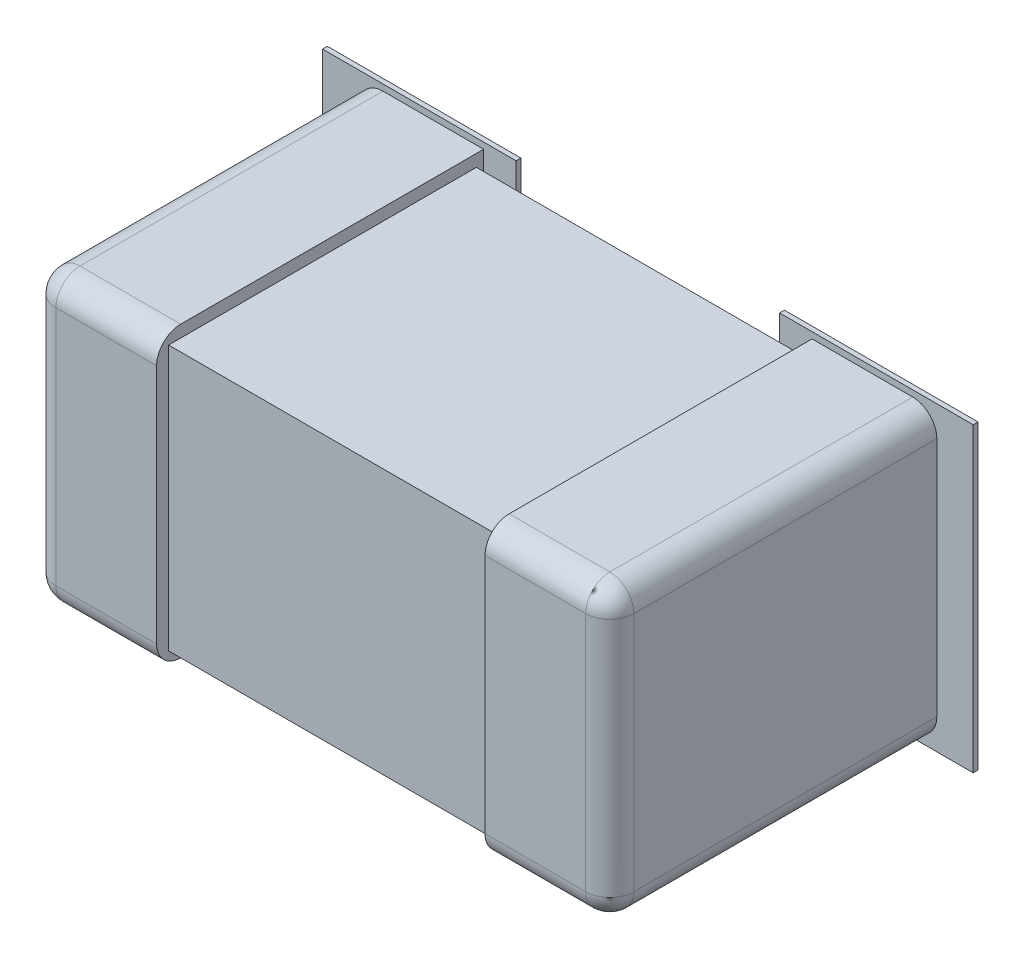
ISO-10303-21;
HEADER;
FILE_DESCRIPTION(('STEP AP214'),'2;1');
FILE_NAME('part.step','',(''),(''),'','','');
FILE_SCHEMA(('AUTOMOTIVE_DESIGN { 1 0 10303 214 1 1 1 1 }'));
ENDSEC;
DATA;
#1=APPLICATION_CONTEXT('core data for automotive mechanical design processes');
#2=APPLICATION_PROTOCOL_DEFINITION('international standard','automotive_design',2000,#1);
#3=PRODUCT_CONTEXT('',#1,'mechanical');
#4=PRODUCT('Part','Part','',(#3));
#5=PRODUCT_RELATED_PRODUCT_CATEGORY('part','',(#4));
#6=PRODUCT_DEFINITION_FORMATION('','',#4);
#7=PRODUCT_DEFINITION_CONTEXT('part definition',#1,'design');
#8=PRODUCT_DEFINITION('design','',#6,#7);
#9=PRODUCT_DEFINITION_SHAPE('','',#8);
#10=(LENGTH_UNIT() NAMED_UNIT(*) SI_UNIT(.MILLI.,.METRE.));
#11=(NAMED_UNIT(*) PLANE_ANGLE_UNIT() SI_UNIT($,.RADIAN.));
#12=(NAMED_UNIT(*) SI_UNIT($,.STERADIAN.) SOLID_ANGLE_UNIT());
#13=UNCERTAINTY_MEASURE_WITH_UNIT(LENGTH_MEASURE(1.E-05),#10,'distance_accuracy_value','');
#14=(GEOMETRIC_REPRESENTATION_CONTEXT(3) GLOBAL_UNCERTAINTY_ASSIGNED_CONTEXT((#13)) GLOBAL_UNIT_ASSIGNED_CONTEXT((#10,
#11,#12)) REPRESENTATION_CONTEXT('',''));
#15=CARTESIAN_POINT('',(0.,0.,0.));
#16=DIRECTION('',(0.,0.,1.));
#17=DIRECTION('',(1.,0.,0.));
#18=AXIS2_PLACEMENT_3D('',#15,#16,#17);
#19=CARTESIAN_POINT('',(0.,0.,0.0762));
#20=DIRECTION('',(0.,0.,1.));
#21=DIRECTION('',(1.,0.,0.));
#22=AXIS2_PLACEMENT_3D('',#19,#20,#21);
#23=PLANE('',#22);
#24=DIRECTION('',(1.,0.,0.));
#25=VECTOR('',#24,1.);
#26=CARTESIAN_POINT('',(0.138938,-0.159004,0.0762));
#27=LINE('',#26,#25);
#28=CARTESIAN_POINT('',(0.138938,-0.159004,0.0762));
#29=VERTEX_POINT('',#28);
#30=CARTESIAN_POINT('',(0.343154,-0.159004,0.0762));
#31=VERTEX_POINT('',#30);
#32=EDGE_CURVE('E341',#29,#31,#27,.T.);
#33=ORIENTED_EDGE('',*,*,#32,.F.);
#34=DIRECTION('',(0.,1.,0.));
#35=VECTOR('',#34,1.);
#36=CARTESIAN_POINT('',(0.138938,0.159004,0.0762));
#37=LINE('',#36,#35);
#38=CARTESIAN_POINT('',(0.138938,0.159004,0.0762));
#39=VERTEX_POINT('',#38);
#40=EDGE_CURVE('E347',#39,#29,#37,.F.);
#41=ORIENTED_EDGE('',*,*,#40,.F.);
#42=DIRECTION('',(1.,0.,0.));
#43=VECTOR('',#42,1.);
#44=CARTESIAN_POINT('',(0.343154,0.159004,0.0762));
#45=LINE('',#44,#43);
#46=CARTESIAN_POINT('',(0.343154,0.159004,0.0762));
#47=VERTEX_POINT('',#46);
#48=EDGE_CURVE('E326',#47,#39,#45,.F.);
#49=ORIENTED_EDGE('',*,*,#48,.F.);
#50=DIRECTION('',(0.,1.,0.));
#51=VECTOR('',#50,1.);
#52=CARTESIAN_POINT('',(0.343154,-0.159004,0.0762));
#53=LINE('',#52,#51);
#54=EDGE_CURVE('E335',#31,#47,#53,.T.);
#55=ORIENTED_EDGE('',*,*,#54,.F.);
#56=EDGE_LOOP('',(#33,#41,#49,#55));
#57=FACE_BOUND('',#56,.T.);
#58=ADVANCED_FACE('F17',(#57),#23,.F.);
#59=CARTESIAN_POINT('',(0.2794,0.127,0.400812));
#60=DIRECTION('',(0.,0.707106781186548,0.707106781186548));
#61=DIRECTION('',(1.,0.,0.));
#62=AXIS2_PLACEMENT_3D('',#59,#60,#61);
#63=SPHERICAL_SURFACE('',#62,0.0254);
#64=CARTESIAN_POINT('',(0.2794,0.127,0.400812));
#65=DIRECTION('',(-1.,0.,0.));
#66=DIRECTION('',(0.,0.,1.));
#67=AXIS2_PLACEMENT_3D('',#64,#65,#66);
#68=CIRCLE('',#67,0.0254);
#69=CARTESIAN_POINT('',(0.2794,0.127,0.426212));
#70=VERTEX_POINT('',#69);
#71=CARTESIAN_POINT('',(0.2794,0.144960512242138,0.418772512242138));
#72=VERTEX_POINT('',#71);
#73=EDGE_CURVE('E313',#70,#72,#68,.T.);
#74=ORIENTED_EDGE('',*,*,#73,.F.);
#75=CARTESIAN_POINT('',(0.2794,0.127,0.400812));
#76=DIRECTION('',(0.,1.,0.));
#77=DIRECTION('',(0.,0.,1.));
#78=AXIS2_PLACEMENT_3D('',#75,#76,#77);
#79=CIRCLE('',#78,0.0254);
#80=CARTESIAN_POINT('',(0.3048,0.127,0.400812));
#81=VERTEX_POINT('',#80);
#82=EDGE_CURVE('E319',#81,#70,#79,.F.);
#83=ORIENTED_EDGE('',*,*,#82,.F.);
#84=CARTESIAN_POINT('',(0.2794,0.127,0.400812));
#85=DIRECTION('',(0.,0.,-1.));
#86=DIRECTION('',(-1.,0.,0.));
#87=AXIS2_PLACEMENT_3D('',#84,#85,#86);
#88=CIRCLE('',#87,0.0254);
#89=CARTESIAN_POINT('',(0.2794,0.1524,0.400812));
#90=VERTEX_POINT('',#89);
#91=EDGE_CURVE('E20',#90,#81,#88,.T.);
#92=ORIENTED_EDGE('',*,*,#91,.F.);
#93=CARTESIAN_POINT('',(0.2794,0.127,0.400812));
#94=DIRECTION('',(-1.,0.,0.));
#95=DIRECTION('',(0.,0.,1.));
#96=AXIS2_PLACEMENT_3D('',#93,#94,#95);
#97=CIRCLE('',#96,0.0254);
#98=EDGE_CURVE('E56',#72,#90,#97,.T.);
#99=ORIENTED_EDGE('',*,*,#98,.F.);
#100=EDGE_LOOP('',(#74,#83,#92,#99));
#101=FACE_BOUND('',#100,.T.);
#102=ADVANCED_FACE('F373',(#101),#63,.T.);
#103=CARTESIAN_POINT('',(0.2794,-0.127,0.400812));
#104=DIRECTION('',(0.707106781186548,0.,0.707106781186548));
#105=DIRECTION('',(0.,-1.,0.));
#106=AXIS2_PLACEMENT_3D('',#103,#104,#105);
#107=SPHERICAL_SURFACE('',#106,0.0254);
#108=CARTESIAN_POINT('',(0.2794,-0.127,0.400812));
#109=DIRECTION('',(0.,1.,0.));
#110=DIRECTION('',(0.,0.,1.));
#111=AXIS2_PLACEMENT_3D('',#108,#109,#110);
#112=CIRCLE('',#111,0.0254);
#113=CARTESIAN_POINT('',(0.2794,-0.127,0.426212));
#114=VERTEX_POINT('',#113);
#115=CARTESIAN_POINT('',(0.297360512242138,-0.127,0.418772512242138));
#116=VERTEX_POINT('',#115);
#117=EDGE_CURVE('E35',#114,#116,#112,.T.);
#118=ORIENTED_EDGE('',*,*,#117,.F.);
#119=CARTESIAN_POINT('',(0.2794,-0.127,0.400812));
#120=DIRECTION('',(1.,0.,0.));
#121=DIRECTION('',(0.,0.,-1.));
#122=AXIS2_PLACEMENT_3D('',#119,#120,#121);
#123=CIRCLE('',#122,0.0254);
#124=CARTESIAN_POINT('',(0.2794,-0.1524,0.400812));
#125=VERTEX_POINT('',#124);
#126=EDGE_CURVE('E398',#125,#114,#123,.F.);
#127=ORIENTED_EDGE('',*,*,#126,.F.);
#128=CARTESIAN_POINT('',(0.2794,-0.127,0.400812));
#129=DIRECTION('',(0.,0.,-1.));
#130=DIRECTION('',(-1.,0.,0.));
#131=AXIS2_PLACEMENT_3D('',#128,#129,#130);
#132=CIRCLE('',#131,0.0254);
#133=CARTESIAN_POINT('',(0.3048,-0.127,0.400812));
#134=VERTEX_POINT('',#133);
#135=EDGE_CURVE('E323',#134,#125,#132,.T.);
#136=ORIENTED_EDGE('',*,*,#135,.F.);
#137=CARTESIAN_POINT('',(0.2794,-0.127,0.400812));
#138=DIRECTION('',(0.,1.,0.));
#139=DIRECTION('',(0.,0.,1.));
#140=AXIS2_PLACEMENT_3D('',#137,#138,#139);
#141=CIRCLE('',#140,0.0254);
#142=EDGE_CURVE('E318',#116,#134,#141,.T.);
#143=ORIENTED_EDGE('',*,*,#142,.F.);
#144=EDGE_LOOP('',(#118,#127,#136,#143));
#145=FACE_BOUND('',#144,.T.);
#146=ADVANCED_FACE('F369',(#145),#107,.T.);
#147=CARTESIAN_POINT('',(0.,0.,0.0762));
#148=DIRECTION('',(0.,0.,1.));
#149=DIRECTION('',(1.,0.,0.));
#150=AXIS2_PLACEMENT_3D('',#147,#148,#149);
#151=PLANE('',#150);
#152=DIRECTION('',(1.,0.,0.));
#153=VECTOR('',#152,1.);
#154=CARTESIAN_POINT('',(-0.138938,0.159004,0.0762));
#155=LINE('',#154,#153);
#156=CARTESIAN_POINT('',(-0.138938,0.159004,0.0762));
#157=VERTEX_POINT('',#156);
#158=CARTESIAN_POINT('',(-0.343154,0.159004,0.0762));
#159=VERTEX_POINT('',#158);
#160=EDGE_CURVE('E302',#157,#159,#155,.F.);
#161=ORIENTED_EDGE('',*,*,#160,.F.);
#162=DIRECTION('',(0.,1.,0.));
#163=VECTOR('',#162,1.);
#164=CARTESIAN_POINT('',(-0.138938,-0.159004,0.0762));
#165=LINE('',#164,#163);
#166=CARTESIAN_POINT('',(-0.138938,-0.159004,0.0762));
#167=VERTEX_POINT('',#166);
#168=EDGE_CURVE('E308',#167,#157,#165,.T.);
#169=ORIENTED_EDGE('',*,*,#168,.F.);
#170=DIRECTION('',(1.,0.,0.));
#171=VECTOR('',#170,1.);
#172=CARTESIAN_POINT('',(-0.343154,-0.159004,0.0762));
#173=LINE('',#172,#171);
#174=CARTESIAN_POINT('',(-0.343154,-0.159004,0.0762));
#175=VERTEX_POINT('',#174);
#176=EDGE_CURVE('E287',#175,#167,#173,.T.);
#177=ORIENTED_EDGE('',*,*,#176,.F.);
#178=DIRECTION('',(0.,1.,0.));
#179=VECTOR('',#178,1.);
#180=CARTESIAN_POINT('',(-0.343154,0.159004,0.0762));
#181=LINE('',#180,#179);
#182=EDGE_CURVE('E296',#159,#175,#181,.F.);
#183=ORIENTED_EDGE('',*,*,#182,.F.);
#184=EDGE_LOOP('',(#161,#169,#177,#183));
#185=FACE_BOUND('',#184,.T.);
#186=ADVANCED_FACE('F365',(#185),#151,.F.);
#187=CARTESIAN_POINT('',(-0.2794,-0.127,0.400812));
#188=DIRECTION('',(0.,-0.707106781186548,0.707106781186548));
#189=DIRECTION('',(-1.,0.,0.));
#190=AXIS2_PLACEMENT_3D('',#187,#188,#189);
#191=SPHERICAL_SURFACE('',#190,0.0254);
#192=CARTESIAN_POINT('',(-0.2794,-0.127,0.400812));
#193=DIRECTION('',(1.,0.,0.));
#194=DIRECTION('',(0.,0.,-1.));
#195=AXIS2_PLACEMENT_3D('',#192,#193,#194);
#196=CIRCLE('',#195,0.0254);
#197=CARTESIAN_POINT('',(-0.2794,-0.127,0.426212));
#198=VERTEX_POINT('',#197);
#199=CARTESIAN_POINT('',(-0.2794,-0.144960512242138,0.418772512242138));
#200=VERTEX_POINT('',#199);
#201=EDGE_CURVE('E271',#198,#200,#196,.T.);
#202=ORIENTED_EDGE('',*,*,#201,.F.);
#203=CARTESIAN_POINT('',(-0.2794,-0.127,0.400812));
#204=DIRECTION('',(0.,-1.,0.));
#205=DIRECTION('',(0.,0.,-1.));
#206=AXIS2_PLACEMENT_3D('',#203,#204,#205);
#207=CIRCLE('',#206,0.0254);
#208=CARTESIAN_POINT('',(-0.3048,-0.127,0.400812));
#209=VERTEX_POINT('',#208);
#210=EDGE_CURVE('E285',#209,#198,#207,.F.);
#211=ORIENTED_EDGE('',*,*,#210,.F.);
#212=CARTESIAN_POINT('',(-0.2794,-0.127,0.400812));
#213=DIRECTION('',(0.,0.,-1.));
#214=DIRECTION('',(-1.,0.,0.));
#215=AXIS2_PLACEMENT_3D('',#212,#213,#214);
#216=CIRCLE('',#215,0.0254);
#217=CARTESIAN_POINT('',(-0.2794,-0.1524,0.400812));
#218=VERTEX_POINT('',#217);
#219=EDGE_CURVE('E286',#218,#209,#216,.T.);
#220=ORIENTED_EDGE('',*,*,#219,.F.);
#221=CARTESIAN_POINT('',(-0.2794,-0.127,0.400812));
#222=DIRECTION('',(1.,0.,0.));
#223=DIRECTION('',(0.,0.,-1.));
#224=AXIS2_PLACEMENT_3D('',#221,#222,#223);
#225=CIRCLE('',#224,0.0254);
#226=EDGE_CURVE('E273',#200,#218,#225,.T.);
#227=ORIENTED_EDGE('',*,*,#226,.F.);
#228=EDGE_LOOP('',(#202,#211,#220,#227));
#229=FACE_BOUND('',#228,.T.);
#230=ADVANCED_FACE('F360',(#229),#191,.T.);
#231=CARTESIAN_POINT('',(-0.2794,0.127,0.400812));
#232=DIRECTION('',(-0.707106781186548,0.707106781186548,0.));
#233=DIRECTION('',(0.,0.,1.));
#234=AXIS2_PLACEMENT_3D('',#231,#232,#233);
#235=SPHERICAL_SURFACE('',#234,0.0254);
#236=CARTESIAN_POINT('',(-0.2794,0.127,0.400812));
#237=DIRECTION('',(0.,-1.,0.));
#238=DIRECTION('',(0.,0.,-1.));
#239=AXIS2_PLACEMENT_3D('',#236,#237,#238);
#240=CIRCLE('',#239,0.0254);
#241=CARTESIAN_POINT('',(-0.2794,0.127,0.426212));
#242=VERTEX_POINT('',#241);
#243=CARTESIAN_POINT('',(-0.3048,0.127,0.400812));
#244=VERTEX_POINT('',#243);
#245=EDGE_CURVE('E393',#242,#244,#240,.T.);
#246=ORIENTED_EDGE('',*,*,#245,.F.);
#247=CARTESIAN_POINT('',(-0.2794,0.127,0.400812));
#248=DIRECTION('',(-1.,0.,0.));
#249=DIRECTION('',(0.,0.,1.));
#250=AXIS2_PLACEMENT_3D('',#247,#248,#249);
#251=CIRCLE('',#250,0.0254);
#252=CARTESIAN_POINT('',(-0.2794,0.1524,0.400812));
#253=VERTEX_POINT('',#252);
#254=EDGE_CURVE('E388',#253,#242,#251,.F.);
#255=ORIENTED_EDGE('',*,*,#254,.F.);
#256=CARTESIAN_POINT('',(-0.2794,0.127,0.400812));
#257=DIRECTION('',(0.,0.,-1.));
#258=DIRECTION('',(-1.,0.,0.));
#259=AXIS2_PLACEMENT_3D('',#256,#257,#258);
#260=CIRCLE('',#259,0.0254);
#261=CARTESIAN_POINT('',(-0.297360512242138,0.144960512242138,0.400812));
#262=VERTEX_POINT('',#261);
#263=EDGE_CURVE('E269',#262,#253,#260,.T.);
#264=ORIENTED_EDGE('',*,*,#263,.F.);
#265=CARTESIAN_POINT('',(-0.2794,0.127,0.400812));
#266=DIRECTION('',(0.,0.,-1.));
#267=DIRECTION('',(-1.,0.,0.));
#268=AXIS2_PLACEMENT_3D('',#265,#266,#267);
#269=CIRCLE('',#268,0.0254);
#270=EDGE_CURVE('E267',#244,#262,#269,.T.);
#271=ORIENTED_EDGE('',*,*,#270,.F.);
#272=EDGE_LOOP('',(#246,#255,#264,#271));
#273=FACE_BOUND('',#272,.T.);
#274=ADVANCED_FACE('F355',(#273),#235,.T.);
#275=CARTESIAN_POINT('',(0.138938,0.159004,0.0762));
#276=DIRECTION('',(-1.,0.,0.));
#277=DIRECTION('',(0.,0.,1.));
#278=AXIS2_PLACEMENT_3D('',#275,#276,#277);
#279=PLANE('',#278);
#280=DIRECTION('',(0.,0.,1.));
#281=VECTOR('',#280,1.);
#282=CARTESIAN_POINT('',(0.138938,0.159004,0.0762));
#283=LINE('',#282,#281);
#284=CARTESIAN_POINT('',(0.138938,0.159004,0.08128));
#285=VERTEX_POINT('',#284);
#286=EDGE_CURVE('E332',#39,#285,#283,.T.);
#287=ORIENTED_EDGE('',*,*,#286,.F.);
#288=ORIENTED_EDGE('',*,*,#40,.T.);
#289=DIRECTION('',(0.,0.,-1.));
#290=VECTOR('',#289,1.);
#291=CARTESIAN_POINT('',(0.138938,-0.159004,0.0762));
#292=LINE('',#291,#290);
#293=CARTESIAN_POINT('',(0.138938,-0.159004,0.08128));
#294=VERTEX_POINT('',#293);
#295=EDGE_CURVE('E344',#294,#29,#292,.T.);
#296=ORIENTED_EDGE('',*,*,#295,.F.);
#297=DIRECTION('',(0.,1.,0.));
#298=VECTOR('',#297,1.);
#299=CARTESIAN_POINT('',(0.138938,0.,0.08128));
#300=LINE('',#299,#298);
#301=EDGE_CURVE('E261',#285,#294,#300,.F.);
#302=ORIENTED_EDGE('',*,*,#301,.F.);
#303=EDGE_LOOP('',(#287,#288,#296,#302));
#304=FACE_BOUND('',#303,.T.);
#305=ADVANCED_FACE('F359',(#304),#279,.T.);
#306=CARTESIAN_POINT('',(0.138938,-0.159004,0.0762));
#307=DIRECTION('',(0.,-1.,0.));
#308=DIRECTION('',(0.,0.,-1.));
#309=AXIS2_PLACEMENT_3D('',#306,#307,#308);
#310=PLANE('',#309);
#311=ORIENTED_EDGE('',*,*,#295,.T.);
#312=ORIENTED_EDGE('',*,*,#32,.T.);
#313=DIRECTION('',(0.,0.,-1.));
#314=VECTOR('',#313,1.);
#315=CARTESIAN_POINT('',(0.343154,-0.159004,0.0762));
#316=LINE('',#315,#314);
#317=CARTESIAN_POINT('',(0.343154,-0.159004,0.08128));
#318=VERTEX_POINT('',#317);
#319=EDGE_CURVE('E338',#318,#31,#316,.T.);
#320=ORIENTED_EDGE('',*,*,#319,.F.);
#321=DIRECTION('',(1.,0.,0.));
#322=VECTOR('',#321,1.);
#323=CARTESIAN_POINT('',(0.,-0.159004,0.08128));
#324=LINE('',#323,#322);
#325=EDGE_CURVE('E258',#294,#318,#324,.T.);
#326=ORIENTED_EDGE('',*,*,#325,.F.);
#327=EDGE_LOOP('',(#311,#312,#320,#326));
#328=FACE_BOUND('',#327,.T.);
#329=ADVANCED_FACE('F529',(#328),#310,.T.);
#330=CARTESIAN_POINT('',(0.343154,-0.159004,0.0762));
#331=DIRECTION('',(1.,0.,0.));
#332=DIRECTION('',(0.,0.,-1.));
#333=AXIS2_PLACEMENT_3D('',#330,#331,#332);
#334=PLANE('',#333);
#335=ORIENTED_EDGE('',*,*,#319,.T.);
#336=ORIENTED_EDGE('',*,*,#54,.T.);
#337=DIRECTION('',(0.,0.,1.));
#338=VECTOR('',#337,1.);
#339=CARTESIAN_POINT('',(0.343154,0.159004,0.0762));
#340=LINE('',#339,#338);
#341=CARTESIAN_POINT('',(0.343154,0.159004,0.08128));
#342=VERTEX_POINT('',#341);
#343=EDGE_CURVE('E329',#342,#47,#340,.F.);
#344=ORIENTED_EDGE('',*,*,#343,.F.);
#345=DIRECTION('',(0.,1.,0.));
#346=VECTOR('',#345,1.);
#347=CARTESIAN_POINT('',(0.343154,0.,0.08128));
#348=LINE('',#347,#346);
#349=EDGE_CURVE('E255',#318,#342,#348,.T.);
#350=ORIENTED_EDGE('',*,*,#349,.F.);
#351=EDGE_LOOP('',(#335,#336,#344,#350));
#352=FACE_BOUND('',#351,.T.);
#353=ADVANCED_FACE('F531',(#352),#334,.T.);
#354=CARTESIAN_POINT('',(0.343154,0.159004,0.0762));
#355=DIRECTION('',(0.,1.,0.));
#356=DIRECTION('',(0.,0.,1.));
#357=AXIS2_PLACEMENT_3D('',#354,#355,#356);
#358=PLANE('',#357);
#359=ORIENTED_EDGE('',*,*,#343,.T.);
#360=ORIENTED_EDGE('',*,*,#48,.T.);
#361=ORIENTED_EDGE('',*,*,#286,.T.);
#362=DIRECTION('',(1.,0.,0.));
#363=VECTOR('',#362,1.);
#364=CARTESIAN_POINT('',(0.,0.159004,0.08128));
#365=LINE('',#364,#363);
#366=EDGE_CURVE('E252',#342,#285,#365,.F.);
#367=ORIENTED_EDGE('',*,*,#366,.F.);
#368=EDGE_LOOP('',(#359,#360,#361,#367));
#369=FACE_BOUND('',#368,.T.);
#370=ADVANCED_FACE('F533',(#369),#358,.T.);
#371=CARTESIAN_POINT('',(0.3048,-0.1524,0.0762));
#372=DIRECTION('',(1.,0.,0.));
#373=DIRECTION('',(0.,0.,-1.));
#374=AXIS2_PLACEMENT_3D('',#371,#372,#373);
#375=PLANE('',#374);
#376=DIRECTION('',(0.,0.,-1.));
#377=VECTOR('',#376,1.);
#378=CARTESIAN_POINT('',(0.3048,-0.127,0.8824876432));
#379=LINE('',#378,#377);
#380=CARTESIAN_POINT('',(0.3048,-0.127,0.08128));
#381=VERTEX_POINT('',#380);
#382=EDGE_CURVE('E148',#381,#134,#379,.F.);
#383=ORIENTED_EDGE('',*,*,#382,.F.);
#384=DIRECTION('',(0.,1.,0.));
#385=VECTOR('',#384,1.);
#386=CARTESIAN_POINT('',(0.3048,0.,0.08128));
#387=LINE('',#386,#385);
#388=CARTESIAN_POINT('',(0.3048,0.127,0.08128));
#389=VERTEX_POINT('',#388);
#390=EDGE_CURVE('E67',#389,#381,#387,.F.);
#391=ORIENTED_EDGE('',*,*,#390,.F.);
#392=DIRECTION('',(0.,0.,-1.));
#393=VECTOR('',#392,1.);
#394=CARTESIAN_POINT('',(0.3048,0.127,0.8824876432));
#395=LINE('',#394,#393);
#396=EDGE_CURVE('E324',#81,#389,#395,.T.);
#397=ORIENTED_EDGE('',*,*,#396,.F.);
#398=DIRECTION('',(0.,1.,0.));
#399=VECTOR('',#398,1.);
#400=CARTESIAN_POINT('',(0.3048,-0.5735592288,0.400812));
#401=LINE('',#400,#399);
#402=EDGE_CURVE('E315',#134,#81,#401,.T.);
#403=ORIENTED_EDGE('',*,*,#402,.F.);
#404=EDGE_LOOP('',(#383,#391,#397,#403));
#405=FACE_BOUND('',#404,.T.);
#406=ADVANCED_FACE('F436',(#405),#375,.T.);
#407=CARTESIAN_POINT('',(0.2794,0.127,0.8824876432));
#408=DIRECTION('',(0.,0.,-1.));
#409=DIRECTION('',(-1.,0.,0.));
#410=AXIS2_PLACEMENT_3D('',#407,#408,#409);
#411=CYLINDRICAL_SURFACE('',#410,0.0254);
#412=ORIENTED_EDGE('',*,*,#396,.T.);
#413=CARTESIAN_POINT('',(0.2794,0.127,0.08128));
#414=DIRECTION('',(0.,0.,-1.));
#415=DIRECTION('',(-1.,0.,0.));
#416=AXIS2_PLACEMENT_3D('',#413,#414,#415);
#417=CIRCLE('',#416,0.0254);
#418=CARTESIAN_POINT('',(0.2794,0.1524,0.08128));
#419=VERTEX_POINT('',#418);
#420=EDGE_CURVE('E251',#419,#389,#417,.T.);
#421=ORIENTED_EDGE('',*,*,#420,.F.);
#422=DIRECTION('',(0.,0.,1.));
#423=VECTOR('',#422,1.);
#424=CARTESIAN_POINT('',(0.2794,0.1524,0.0762));
#425=LINE('',#424,#423);
#426=EDGE_CURVE('E244',#90,#419,#425,.F.);
#427=ORIENTED_EDGE('',*,*,#426,.F.);
#428=ORIENTED_EDGE('',*,*,#91,.T.);
#429=EDGE_LOOP('',(#412,#421,#427,#428));
#430=FACE_BOUND('',#429,.T.);
#431=ADVANCED_FACE('F414',(#430),#411,.T.);
#432=CARTESIAN_POINT('',(0.2794,-0.5735592288,0.400812));
#433=DIRECTION('',(0.,1.,0.));
#434=DIRECTION('',(0.,0.,1.));
#435=AXIS2_PLACEMENT_3D('',#432,#433,#434);
#436=CYLINDRICAL_SURFACE('',#435,0.0254);
#437=ORIENTED_EDGE('',*,*,#142,.T.);
#438=ORIENTED_EDGE('',*,*,#402,.T.);
#439=ORIENTED_EDGE('',*,*,#82,.T.);
#440=DIRECTION('',(0.,1.,0.));
#441=VECTOR('',#440,1.);
#442=CARTESIAN_POINT('',(0.2794,0.,0.426212));
#443=LINE('',#442,#441);
#444=EDGE_CURVE('E156',#114,#70,#443,.T.);
#445=ORIENTED_EDGE('',*,*,#444,.F.);
#446=ORIENTED_EDGE('',*,*,#117,.T.);
#447=EDGE_LOOP('',(#437,#438,#439,#445,#446));
#448=FACE_BOUND('',#447,.T.);
#449=ADVANCED_FACE('F405',(#448),#436,.T.);
#450=CARTESIAN_POINT('',(1.2378251088,0.127,0.400812));
#451=DIRECTION('',(-1.,0.,0.));
#452=DIRECTION('',(0.,0.,1.));
#453=AXIS2_PLACEMENT_3D('',#450,#451,#452);
#454=CYLINDRICAL_SURFACE('',#453,0.0254);
#455=DIRECTION('',(1.,0.,0.));
#456=VECTOR('',#455,1.);
#457=CARTESIAN_POINT('',(0.3048,0.1524,0.400812));
#458=LINE('',#457,#456);
#459=CARTESIAN_POINT('',(0.173228,0.1524,0.400812));
#460=VERTEX_POINT('',#459);
#461=EDGE_CURVE('E143',#460,#90,#458,.T.);
#462=ORIENTED_EDGE('',*,*,#461,.F.);
#463=CARTESIAN_POINT('',(0.173228,0.127,0.400812));
#464=DIRECTION('',(-1.,0.,0.));
#465=DIRECTION('',(0.,0.,1.));
#466=AXIS2_PLACEMENT_3D('',#463,#464,#465);
#467=CIRCLE('',#466,0.0254);
#468=CARTESIAN_POINT('',(0.173228,0.127,0.426212));
#469=VERTEX_POINT('',#468);
#470=EDGE_CURVE('E139',#460,#469,#467,.F.);
#471=ORIENTED_EDGE('',*,*,#470,.T.);
#472=DIRECTION('',(1.,0.,0.));
#473=VECTOR('',#472,1.);
#474=CARTESIAN_POINT('',(0.,0.127,0.426212));
#475=LINE('',#474,#473);
#476=EDGE_CURVE('E142',#70,#469,#475,.F.);
#477=ORIENTED_EDGE('',*,*,#476,.F.);
#478=ORIENTED_EDGE('',*,*,#73,.T.);
#479=ORIENTED_EDGE('',*,*,#98,.T.);
#480=EDGE_LOOP('',(#462,#471,#477,#478,#479));
#481=FACE_BOUND('',#480,.T.);
#482=ADVANCED_FACE('F141',(#481),#454,.T.);
#483=CARTESIAN_POINT('',(0.2794,-0.127,0.8824876432));
#484=DIRECTION('',(0.,0.,-1.));
#485=DIRECTION('',(-1.,0.,0.));
#486=AXIS2_PLACEMENT_3D('',#483,#484,#485);
#487=CYLINDRICAL_SURFACE('',#486,0.0254);
#488=DIRECTION('',(0.,0.,-1.));
#489=VECTOR('',#488,1.);
#490=CARTESIAN_POINT('',(0.2794,-0.1524,0.0762));
#491=LINE('',#490,#489);
#492=CARTESIAN_POINT('',(0.2794,-0.1524,0.08128));
#493=VERTEX_POINT('',#492);
#494=EDGE_CURVE('E157',#493,#125,#491,.F.);
#495=ORIENTED_EDGE('',*,*,#494,.F.);
#496=CARTESIAN_POINT('',(0.2794,-0.127,0.08128));
#497=DIRECTION('',(0.,0.,-1.));
#498=DIRECTION('',(-1.,0.,0.));
#499=AXIS2_PLACEMENT_3D('',#496,#497,#498);
#500=CIRCLE('',#499,0.0254);
#501=EDGE_CURVE('E245',#381,#493,#500,.T.);
#502=ORIENTED_EDGE('',*,*,#501,.F.);
#503=ORIENTED_EDGE('',*,*,#382,.T.);
#504=ORIENTED_EDGE('',*,*,#135,.T.);
#505=EDGE_LOOP('',(#495,#502,#503,#504));
#506=FACE_BOUND('',#505,.T.);
#507=ADVANCED_FACE('F434',(#506),#487,.T.);
#508=CARTESIAN_POINT('',(-1.2378251088,-0.127,0.400812));
#509=DIRECTION('',(1.,0.,0.));
#510=DIRECTION('',(0.,0.,-1.));
#511=AXIS2_PLACEMENT_3D('',#508,#509,#510);
#512=CYLINDRICAL_SURFACE('',#511,0.0254);
#513=DIRECTION('',(1.,0.,0.));
#514=VECTOR('',#513,1.);
#515=CARTESIAN_POINT('',(0.,-0.127,0.426212));
#516=LINE('',#515,#514);
#517=CARTESIAN_POINT('',(0.173228,-0.127,0.426212));
#518=VERTEX_POINT('',#517);
#519=EDGE_CURVE('E240',#518,#114,#516,.T.);
#520=ORIENTED_EDGE('',*,*,#519,.F.);
#521=CARTESIAN_POINT('',(0.173228,-0.127,0.400812));
#522=DIRECTION('',(1.,0.,0.));
#523=DIRECTION('',(0.,0.,-1.));
#524=AXIS2_PLACEMENT_3D('',#521,#522,#523);
#525=CIRCLE('',#524,0.0254);
#526=CARTESIAN_POINT('',(0.173228,-0.1524,0.400812));
#527=VERTEX_POINT('',#526);
#528=EDGE_CURVE('E161',#518,#527,#525,.T.);
#529=ORIENTED_EDGE('',*,*,#528,.T.);
#530=DIRECTION('',(1.,0.,0.));
#531=VECTOR('',#530,1.);
#532=CARTESIAN_POINT('',(-0.3048,-0.1524,0.400812));
#533=LINE('',#532,#531);
#534=EDGE_CURVE('E229',#125,#527,#533,.F.);
#535=ORIENTED_EDGE('',*,*,#534,.F.);
#536=ORIENTED_EDGE('',*,*,#126,.T.);
#537=EDGE_LOOP('',(#520,#529,#535,#536));
#538=FACE_BOUND('',#537,.T.);
#539=ADVANCED_FACE('F431',(#538),#512,.T.);
#540=CARTESIAN_POINT('',(-0.138938,-0.159004,0.0762));
#541=DIRECTION('',(1.,0.,0.));
#542=DIRECTION('',(0.,0.,-1.));
#543=AXIS2_PLACEMENT_3D('',#540,#541,#542);
#544=PLANE('',#543);
#545=DIRECTION('',(0.,0.,-1.));
#546=VECTOR('',#545,1.);
#547=CARTESIAN_POINT('',(-0.138938,-0.159004,0.0762));
#548=LINE('',#547,#546);
#549=CARTESIAN_POINT('',(-0.138938,-0.159004,0.08128));
#550=VERTEX_POINT('',#549);
#551=EDGE_CURVE('E293',#167,#550,#548,.F.);
#552=ORIENTED_EDGE('',*,*,#551,.F.);
#553=ORIENTED_EDGE('',*,*,#168,.T.);
#554=DIRECTION('',(0.,0.,1.));
#555=VECTOR('',#554,1.);
#556=CARTESIAN_POINT('',(-0.138938,0.159004,0.0762));
#557=LINE('',#556,#555);
#558=CARTESIAN_POINT('',(-0.138938,0.159004,0.08128));
#559=VERTEX_POINT('',#558);
#560=EDGE_CURVE('E305',#559,#157,#557,.F.);
#561=ORIENTED_EDGE('',*,*,#560,.F.);
#562=DIRECTION('',(0.,1.,0.));
#563=VECTOR('',#562,1.);
#564=CARTESIAN_POINT('',(-0.138938,0.,0.08128));
#565=LINE('',#564,#563);
#566=EDGE_CURVE('E225',#550,#559,#565,.T.);
#567=ORIENTED_EDGE('',*,*,#566,.F.);
#568=EDGE_LOOP('',(#552,#553,#561,#567));
#569=FACE_BOUND('',#568,.T.);
#570=ADVANCED_FACE('F493',(#569),#544,.T.);
#571=CARTESIAN_POINT('',(-0.138938,0.159004,0.0762));
#572=DIRECTION('',(0.,1.,0.));
#573=DIRECTION('',(0.,0.,1.));
#574=AXIS2_PLACEMENT_3D('',#571,#572,#573);
#575=PLANE('',#574);
#576=ORIENTED_EDGE('',*,*,#560,.T.);
#577=ORIENTED_EDGE('',*,*,#160,.T.);
#578=DIRECTION('',(0.,0.,1.));
#579=VECTOR('',#578,1.);
#580=CARTESIAN_POINT('',(-0.343154,0.159004,0.0762));
#581=LINE('',#580,#579);
#582=CARTESIAN_POINT('',(-0.343154,0.159004,0.08128));
#583=VERTEX_POINT('',#582);
#584=EDGE_CURVE('E299',#583,#159,#581,.F.);
#585=ORIENTED_EDGE('',*,*,#584,.F.);
#586=DIRECTION('',(1.,0.,0.));
#587=VECTOR('',#586,1.);
#588=CARTESIAN_POINT('',(0.,0.159004,0.08128));
#589=LINE('',#588,#587);
#590=EDGE_CURVE('E222',#559,#583,#589,.F.);
#591=ORIENTED_EDGE('',*,*,#590,.F.);
#592=EDGE_LOOP('',(#576,#577,#585,#591));
#593=FACE_BOUND('',#592,.T.);
#594=ADVANCED_FACE('F500',(#593),#575,.T.);
#595=CARTESIAN_POINT('',(-0.343154,0.159004,0.0762));
#596=DIRECTION('',(-1.,0.,0.));
#597=DIRECTION('',(0.,0.,1.));
#598=AXIS2_PLACEMENT_3D('',#595,#596,#597);
#599=PLANE('',#598);
#600=ORIENTED_EDGE('',*,*,#584,.T.);
#601=ORIENTED_EDGE('',*,*,#182,.T.);
#602=DIRECTION('',(0.,0.,-1.));
#603=VECTOR('',#602,1.);
#604=CARTESIAN_POINT('',(-0.343154,-0.159004,0.0762));
#605=LINE('',#604,#603);
#606=CARTESIAN_POINT('',(-0.343154,-0.159004,0.08128));
#607=VERTEX_POINT('',#606);
#608=EDGE_CURVE('E290',#607,#175,#605,.T.);
#609=ORIENTED_EDGE('',*,*,#608,.F.);
#610=DIRECTION('',(0.,1.,0.));
#611=VECTOR('',#610,1.);
#612=CARTESIAN_POINT('',(-0.343154,0.,0.08128));
#613=LINE('',#612,#611);
#614=EDGE_CURVE('E219',#583,#607,#613,.F.);
#615=ORIENTED_EDGE('',*,*,#614,.F.);
#616=EDGE_LOOP('',(#600,#601,#609,#615));
#617=FACE_BOUND('',#616,.T.);
#618=ADVANCED_FACE('F505',(#617),#599,.T.);
#619=CARTESIAN_POINT('',(-0.343154,-0.159004,0.0762));
#620=DIRECTION('',(0.,-1.,0.));
#621=DIRECTION('',(0.,0.,-1.));
#622=AXIS2_PLACEMENT_3D('',#619,#620,#621);
#623=PLANE('',#622);
#624=ORIENTED_EDGE('',*,*,#608,.T.);
#625=ORIENTED_EDGE('',*,*,#176,.T.);
#626=ORIENTED_EDGE('',*,*,#551,.T.);
#627=DIRECTION('',(1.,0.,0.));
#628=VECTOR('',#627,1.);
#629=CARTESIAN_POINT('',(0.,-0.159004,0.08128));
#630=LINE('',#629,#628);
#631=EDGE_CURVE('E216',#607,#550,#630,.T.);
#632=ORIENTED_EDGE('',*,*,#631,.F.);
#633=EDGE_LOOP('',(#624,#625,#626,#632));
#634=FACE_BOUND('',#633,.T.);
#635=ADVANCED_FACE('F510',(#634),#623,.T.);
#636=CARTESIAN_POINT('',(-0.3048,0.1524,0.0762));
#637=DIRECTION('',(-1.,0.,0.));
#638=DIRECTION('',(0.,0.,1.));
#639=AXIS2_PLACEMENT_3D('',#636,#637,#638);
#640=PLANE('',#639);
#641=DIRECTION('',(0.,0.,-1.));
#642=VECTOR('',#641,1.);
#643=CARTESIAN_POINT('',(-0.3048,0.127,0.8824876432));
#644=LINE('',#643,#642);
#645=CARTESIAN_POINT('',(-0.3048,0.127,0.08128));
#646=VERTEX_POINT('',#645);
#647=EDGE_CURVE('E270',#646,#244,#644,.F.);
#648=ORIENTED_EDGE('',*,*,#647,.F.);
#649=DIRECTION('',(0.,1.,0.));
#650=VECTOR('',#649,1.);
#651=CARTESIAN_POINT('',(-0.3048,0.,0.08128));
#652=LINE('',#651,#650);
#653=CARTESIAN_POINT('',(-0.3048,-0.127,0.08128));
#654=VERTEX_POINT('',#653);
#655=EDGE_CURVE('E212',#654,#646,#652,.T.);
#656=ORIENTED_EDGE('',*,*,#655,.F.);
#657=DIRECTION('',(0.,0.,-1.));
#658=VECTOR('',#657,1.);
#659=CARTESIAN_POINT('',(-0.3048,-0.127,0.8824876432));
#660=LINE('',#659,#658);
#661=EDGE_CURVE('E282',#209,#654,#660,.T.);
#662=ORIENTED_EDGE('',*,*,#661,.F.);
#663=DIRECTION('',(0.,-1.,0.));
#664=VECTOR('',#663,1.);
#665=CARTESIAN_POINT('',(-0.3048,0.5735592288,0.400812));
#666=LINE('',#665,#664);
#667=EDGE_CURVE('E274',#244,#209,#666,.T.);
#668=ORIENTED_EDGE('',*,*,#667,.F.);
#669=EDGE_LOOP('',(#648,#656,#662,#668));
#670=FACE_BOUND('',#669,.T.);
#671=ADVANCED_FACE('F607',(#670),#640,.T.);
#672=CARTESIAN_POINT('',(-0.2794,-0.127,0.8824876432));
#673=DIRECTION('',(0.,0.,-1.));
#674=DIRECTION('',(-1.,0.,0.));
#675=AXIS2_PLACEMENT_3D('',#672,#673,#674);
#676=CYLINDRICAL_SURFACE('',#675,0.0254);
#677=ORIENTED_EDGE('',*,*,#661,.T.);
#678=CARTESIAN_POINT('',(-0.2794,-0.127,0.08128));
#679=DIRECTION('',(0.,0.,-1.));
#680=DIRECTION('',(-1.,0.,0.));
#681=AXIS2_PLACEMENT_3D('',#678,#679,#680);
#682=CIRCLE('',#681,0.0254);
#683=CARTESIAN_POINT('',(-0.2794,-0.1524,0.08128));
#684=VERTEX_POINT('',#683);
#685=EDGE_CURVE('E215',#684,#654,#682,.T.);
#686=ORIENTED_EDGE('',*,*,#685,.F.);
#687=DIRECTION('',(0.,0.,-1.));
#688=VECTOR('',#687,1.);
#689=CARTESIAN_POINT('',(-0.2794,-0.1524,0.0762));
#690=LINE('',#689,#688);
#691=EDGE_CURVE('E206',#218,#684,#690,.T.);
#692=ORIENTED_EDGE('',*,*,#691,.F.);
#693=ORIENTED_EDGE('',*,*,#219,.T.);
#694=EDGE_LOOP('',(#677,#686,#692,#693));
#695=FACE_BOUND('',#694,.T.);
#696=ADVANCED_FACE('F461',(#695),#676,.T.);
#697=CARTESIAN_POINT('',(-0.2794,0.5735592288,0.400812));
#698=DIRECTION('',(0.,-1.,0.));
#699=DIRECTION('',(0.,0.,-1.));
#700=AXIS2_PLACEMENT_3D('',#697,#698,#699);
#701=CYLINDRICAL_SURFACE('',#700,0.0254);
#702=ORIENTED_EDGE('',*,*,#245,.T.);
#703=ORIENTED_EDGE('',*,*,#667,.T.);
#704=ORIENTED_EDGE('',*,*,#210,.T.);
#705=DIRECTION('',(0.,1.,0.));
#706=VECTOR('',#705,1.);
#707=CARTESIAN_POINT('',(-0.2794,0.,0.426212));
#708=LINE('',#707,#706);
#709=EDGE_CURVE('E198',#242,#198,#708,.F.);
#710=ORIENTED_EDGE('',*,*,#709,.F.);
#711=EDGE_LOOP('',(#702,#703,#704,#710));
#712=FACE_BOUND('',#711,.T.);
#713=ADVANCED_FACE('F600',(#712),#701,.T.);
#714=CARTESIAN_POINT('',(-1.2378251088,-0.127,0.400812));
#715=DIRECTION('',(1.,0.,0.));
#716=DIRECTION('',(0.,0.,-1.));
#717=AXIS2_PLACEMENT_3D('',#714,#715,#716);
#718=CYLINDRICAL_SURFACE('',#717,0.0254);
#719=DIRECTION('',(1.,0.,0.));
#720=VECTOR('',#719,1.);
#721=CARTESIAN_POINT('',(-0.3048,-0.1524,0.400812));
#722=LINE('',#721,#720);
#723=CARTESIAN_POINT('',(-0.173228,-0.1524,0.400812));
#724=VERTEX_POINT('',#723);
#725=EDGE_CURVE('E203',#724,#218,#722,.F.);
#726=ORIENTED_EDGE('',*,*,#725,.F.);
#727=CARTESIAN_POINT('',(-0.173228,-0.127,0.400812));
#728=DIRECTION('',(1.,0.,0.));
#729=DIRECTION('',(0.,0.,-1.));
#730=AXIS2_PLACEMENT_3D('',#727,#728,#729);
#731=CIRCLE('',#730,0.0254);
#732=CARTESIAN_POINT('',(-0.173228,-0.127,0.426212));
#733=VERTEX_POINT('',#732);
#734=EDGE_CURVE('E281',#724,#733,#731,.F.);
#735=ORIENTED_EDGE('',*,*,#734,.T.);
#736=DIRECTION('',(1.,0.,0.));
#737=VECTOR('',#736,1.);
#738=CARTESIAN_POINT('',(0.,-0.127,0.426212));
#739=LINE('',#738,#737);
#740=EDGE_CURVE('E195',#198,#733,#739,.T.);
#741=ORIENTED_EDGE('',*,*,#740,.F.);
#742=ORIENTED_EDGE('',*,*,#201,.T.);
#743=ORIENTED_EDGE('',*,*,#226,.T.);
#744=EDGE_LOOP('',(#726,#735,#741,#742,#743));
#745=FACE_BOUND('',#744,.T.);
#746=ADVANCED_FACE('F596',(#745),#718,.T.);
#747=CARTESIAN_POINT('',(-0.2794,0.127,0.8824876432));
#748=DIRECTION('',(0.,0.,-1.));
#749=DIRECTION('',(-1.,0.,0.));
#750=AXIS2_PLACEMENT_3D('',#747,#748,#749);
#751=CYLINDRICAL_SURFACE('',#750,0.0254);
#752=DIRECTION('',(0.,0.,1.));
#753=VECTOR('',#752,1.);
#754=CARTESIAN_POINT('',(-0.2794,0.1524,0.0762));
#755=LINE('',#754,#753);
#756=CARTESIAN_POINT('',(-0.2794,0.1524,0.08128));
#757=VERTEX_POINT('',#756);
#758=EDGE_CURVE('E183',#757,#253,#755,.T.);
#759=ORIENTED_EDGE('',*,*,#758,.F.);
#760=CARTESIAN_POINT('',(-0.2794,0.127,0.08128));
#761=DIRECTION('',(0.,0.,-1.));
#762=DIRECTION('',(-1.,0.,0.));
#763=AXIS2_PLACEMENT_3D('',#760,#761,#762);
#764=CIRCLE('',#763,0.0254);
#765=EDGE_CURVE('E207',#646,#757,#764,.T.);
#766=ORIENTED_EDGE('',*,*,#765,.F.);
#767=ORIENTED_EDGE('',*,*,#647,.T.);
#768=ORIENTED_EDGE('',*,*,#270,.T.);
#769=ORIENTED_EDGE('',*,*,#263,.T.);
#770=EDGE_LOOP('',(#759,#766,#767,#768,#769));
#771=FACE_BOUND('',#770,.T.);
#772=ADVANCED_FACE('F592',(#771),#751,.T.);
#773=CARTESIAN_POINT('',(1.2378251088,0.127,0.400812));
#774=DIRECTION('',(-1.,0.,0.));
#775=DIRECTION('',(0.,0.,1.));
#776=AXIS2_PLACEMENT_3D('',#773,#774,#775);
#777=CYLINDRICAL_SURFACE('',#776,0.0254);
#778=DIRECTION('',(1.,0.,0.));
#779=VECTOR('',#778,1.);
#780=CARTESIAN_POINT('',(0.,0.127,0.426212));
#781=LINE('',#780,#779);
#782=CARTESIAN_POINT('',(-0.173228,0.127,0.426212));
#783=VERTEX_POINT('',#782);
#784=EDGE_CURVE('E199',#783,#242,#781,.F.);
#785=ORIENTED_EDGE('',*,*,#784,.F.);
#786=CARTESIAN_POINT('',(-0.173228,0.127,0.400812));
#787=DIRECTION('',(-1.,0.,0.));
#788=DIRECTION('',(0.,0.,1.));
#789=AXIS2_PLACEMENT_3D('',#786,#787,#788);
#790=CIRCLE('',#789,0.0254);
#791=CARTESIAN_POINT('',(-0.173228,0.1524,0.400812));
#792=VERTEX_POINT('',#791);
#793=EDGE_CURVE('E264',#783,#792,#790,.T.);
#794=ORIENTED_EDGE('',*,*,#793,.T.);
#795=DIRECTION('',(1.,0.,0.));
#796=VECTOR('',#795,1.);
#797=CARTESIAN_POINT('',(0.3048,0.1524,0.400812));
#798=LINE('',#797,#796);
#799=EDGE_CURVE('E180',#253,#792,#798,.T.);
#800=ORIENTED_EDGE('',*,*,#799,.F.);
#801=ORIENTED_EDGE('',*,*,#254,.T.);
#802=EDGE_LOOP('',(#785,#794,#800,#801));
#803=FACE_BOUND('',#802,.T.);
#804=ADVANCED_FACE('F589',(#803),#777,.T.);
#805=CARTESIAN_POINT('',(0.,0.,0.08128));
#806=DIRECTION('',(0.,0.,1.));
#807=DIRECTION('',(1.,0.,0.));
#808=AXIS2_PLACEMENT_3D('',#805,#806,#807);
#809=PLANE('',#808);
#810=DIRECTION('',(0.,1.,0.));
#811=VECTOR('',#810,1.);
#812=CARTESIAN_POINT('',(0.173228,-0.1524,0.08128));
#813=LINE('',#812,#811);
#814=CARTESIAN_POINT('',(0.173228,-0.1524,0.08128));
#815=VERTEX_POINT('',#814);
#816=CARTESIAN_POINT('',(0.173228,0.1524,0.08128));
#817=VERTEX_POINT('',#816);
#818=EDGE_CURVE('E169',#815,#817,#813,.T.);
#819=ORIENTED_EDGE('',*,*,#818,.T.);
#820=DIRECTION('',(1.,0.,0.));
#821=VECTOR('',#820,1.);
#822=CARTESIAN_POINT('',(0.3048,0.1524,0.08128));
#823=LINE('',#822,#821);
#824=EDGE_CURVE('E242',#419,#817,#823,.F.);
#825=ORIENTED_EDGE('',*,*,#824,.F.);
#826=ORIENTED_EDGE('',*,*,#420,.T.);
#827=ORIENTED_EDGE('',*,*,#390,.T.);
#828=ORIENTED_EDGE('',*,*,#501,.T.);
#829=DIRECTION('',(1.,0.,0.));
#830=VECTOR('',#829,1.);
#831=CARTESIAN_POINT('',(-0.3048,-0.1524,0.08128));
#832=LINE('',#831,#830);
#833=EDGE_CURVE('E228',#815,#493,#832,.T.);
#834=ORIENTED_EDGE('',*,*,#833,.F.);
#835=EDGE_LOOP('',(#819,#825,#826,#827,#828,#834));
#836=FACE_BOUND('',#835,.T.);
#837=ORIENTED_EDGE('',*,*,#349,.T.);
#838=ORIENTED_EDGE('',*,*,#366,.T.);
#839=ORIENTED_EDGE('',*,*,#301,.T.);
#840=ORIENTED_EDGE('',*,*,#325,.T.);
#841=EDGE_LOOP('',(#837,#838,#839,#840));
#842=FACE_BOUND('',#841,.T.);
#843=ADVANCED_FACE('F421',(#836,#842),#809,.T.);
#844=CARTESIAN_POINT('',(0.3048,0.1524,0.0762));
#845=DIRECTION('',(0.,1.,0.));
#846=DIRECTION('',(0.,0.,1.));
#847=AXIS2_PLACEMENT_3D('',#844,#845,#846);
#848=PLANE('',#847);
#849=ORIENTED_EDGE('',*,*,#426,.T.);
#850=ORIENTED_EDGE('',*,*,#824,.T.);
#851=DIRECTION('',(0.,0.,-1.));
#852=VECTOR('',#851,1.);
#853=CARTESIAN_POINT('',(0.173228,0.1524,0.0889));
#854=LINE('',#853,#852);
#855=EDGE_CURVE('E164',#817,#460,#854,.F.);
#856=ORIENTED_EDGE('',*,*,#855,.T.);
#857=ORIENTED_EDGE('',*,*,#461,.T.);
#858=EDGE_LOOP('',(#849,#850,#856,#857));
#859=FACE_BOUND('',#858,.T.);
#860=ADVANCED_FACE('F417',(#859),#848,.T.);
#861=CARTESIAN_POINT('',(0.,0.,0.426212));
#862=DIRECTION('',(0.,0.,1.));
#863=DIRECTION('',(1.,0.,0.));
#864=AXIS2_PLACEMENT_3D('',#861,#862,#863);
#865=PLANE('',#864);
#866=ORIENTED_EDGE('',*,*,#444,.T.);
#867=ORIENTED_EDGE('',*,*,#476,.T.);
#868=DIRECTION('',(0.,1.,0.));
#869=VECTOR('',#868,1.);
#870=CARTESIAN_POINT('',(0.173228,-0.1524,0.426212));
#871=LINE('',#870,#869);
#872=EDGE_CURVE('E155',#469,#518,#871,.F.);
#873=ORIENTED_EDGE('',*,*,#872,.T.);
#874=ORIENTED_EDGE('',*,*,#519,.T.);
#875=EDGE_LOOP('',(#866,#867,#873,#874));
#876=FACE_BOUND('',#875,.T.);
#877=ADVANCED_FACE('F153',(#876),#865,.T.);
#878=CARTESIAN_POINT('',(-0.3048,-0.1524,0.0762));
#879=DIRECTION('',(0.,-1.,0.));
#880=DIRECTION('',(0.,0.,-1.));
#881=AXIS2_PLACEMENT_3D('',#878,#879,#880);
#882=PLANE('',#881);
#883=DIRECTION('',(0.,0.,-1.));
#884=VECTOR('',#883,1.);
#885=CARTESIAN_POINT('',(0.173228,-0.1524,0.0889));
#886=LINE('',#885,#884);
#887=EDGE_CURVE('E163',#527,#815,#886,.T.);
#888=ORIENTED_EDGE('',*,*,#887,.T.);
#889=ORIENTED_EDGE('',*,*,#833,.T.);
#890=ORIENTED_EDGE('',*,*,#494,.T.);
#891=ORIENTED_EDGE('',*,*,#534,.T.);
#892=EDGE_LOOP('',(#888,#889,#890,#891));
#893=FACE_BOUND('',#892,.T.);
#894=ADVANCED_FACE('F427',(#893),#882,.T.);
#895=CARTESIAN_POINT('',(0.,0.,0.08128));
#896=DIRECTION('',(0.,0.,1.));
#897=DIRECTION('',(1.,0.,0.));
#898=AXIS2_PLACEMENT_3D('',#895,#896,#897);
#899=PLANE('',#898);
#900=DIRECTION('',(0.,1.,0.));
#901=VECTOR('',#900,1.);
#902=CARTESIAN_POINT('',(-0.173228,-0.1524,0.08128));
#903=LINE('',#902,#901);
#904=CARTESIAN_POINT('',(-0.173228,0.1524,0.08128));
#905=VERTEX_POINT('',#904);
#906=CARTESIAN_POINT('',(-0.173228,-0.1524,0.08128));
#907=VERTEX_POINT('',#906);
#908=EDGE_CURVE('E188',#905,#907,#903,.F.);
#909=ORIENTED_EDGE('',*,*,#908,.T.);
#910=DIRECTION('',(1.,0.,0.));
#911=VECTOR('',#910,1.);
#912=CARTESIAN_POINT('',(-0.3048,-0.1524,0.08128));
#913=LINE('',#912,#911);
#914=EDGE_CURVE('E202',#684,#907,#913,.T.);
#915=ORIENTED_EDGE('',*,*,#914,.F.);
#916=ORIENTED_EDGE('',*,*,#685,.T.);
#917=ORIENTED_EDGE('',*,*,#655,.T.);
#918=ORIENTED_EDGE('',*,*,#765,.T.);
#919=DIRECTION('',(1.,0.,0.));
#920=VECTOR('',#919,1.);
#921=CARTESIAN_POINT('',(0.3048,0.1524,0.08128));
#922=LINE('',#921,#920);
#923=EDGE_CURVE('E179',#905,#757,#922,.F.);
#924=ORIENTED_EDGE('',*,*,#923,.F.);
#925=EDGE_LOOP('',(#909,#915,#916,#917,#918,#924));
#926=FACE_BOUND('',#925,.T.);
#927=ORIENTED_EDGE('',*,*,#614,.T.);
#928=ORIENTED_EDGE('',*,*,#631,.T.);
#929=ORIENTED_EDGE('',*,*,#566,.T.);
#930=ORIENTED_EDGE('',*,*,#590,.T.);
#931=EDGE_LOOP('',(#927,#928,#929,#930));
#932=FACE_BOUND('',#931,.T.);
#933=ADVANCED_FACE('F465',(#926,#932),#899,.T.);
#934=CARTESIAN_POINT('',(-0.3048,-0.1524,0.0762));
#935=DIRECTION('',(0.,-1.,0.));
#936=DIRECTION('',(0.,0.,-1.));
#937=AXIS2_PLACEMENT_3D('',#934,#935,#936);
#938=PLANE('',#937);
#939=ORIENTED_EDGE('',*,*,#691,.T.);
#940=ORIENTED_EDGE('',*,*,#914,.T.);
#941=DIRECTION('',(0.,0.,1.));
#942=VECTOR('',#941,1.);
#943=CARTESIAN_POINT('',(-0.173228,-0.1524,0.0762));
#944=LINE('',#943,#942);
#945=EDGE_CURVE('E191',#907,#724,#944,.T.);
#946=ORIENTED_EDGE('',*,*,#945,.T.);
#947=ORIENTED_EDGE('',*,*,#725,.T.);
#948=EDGE_LOOP('',(#939,#940,#946,#947));
#949=FACE_BOUND('',#948,.T.);
#950=ADVANCED_FACE('F454',(#949),#938,.T.);
#951=CARTESIAN_POINT('',(0.,0.,0.426212));
#952=DIRECTION('',(0.,0.,1.));
#953=DIRECTION('',(1.,0.,0.));
#954=AXIS2_PLACEMENT_3D('',#951,#952,#953);
#955=PLANE('',#954);
#956=ORIENTED_EDGE('',*,*,#709,.T.);
#957=ORIENTED_EDGE('',*,*,#740,.T.);
#958=DIRECTION('',(0.,1.,0.));
#959=VECTOR('',#958,1.);
#960=CARTESIAN_POINT('',(-0.173228,-0.1524,0.426212));
#961=LINE('',#960,#959);
#962=EDGE_CURVE('E927',#733,#783,#961,.T.);
#963=ORIENTED_EDGE('',*,*,#962,.T.);
#964=ORIENTED_EDGE('',*,*,#784,.T.);
#965=EDGE_LOOP('',(#956,#957,#963,#964));
#966=FACE_BOUND('',#965,.T.);
#967=ADVANCED_FACE('F572',(#966),#955,.T.);
#968=CARTESIAN_POINT('',(0.3048,0.1524,0.0762));
#969=DIRECTION('',(0.,1.,0.));
#970=DIRECTION('',(0.,0.,1.));
#971=AXIS2_PLACEMENT_3D('',#968,#969,#970);
#972=PLANE('',#971);
#973=DIRECTION('',(0.,0.,1.));
#974=VECTOR('',#973,1.);
#975=CARTESIAN_POINT('',(-0.173228,0.1524,0.0762));
#976=LINE('',#975,#974);
#977=EDGE_CURVE('E475',#792,#905,#976,.F.);
#978=ORIENTED_EDGE('',*,*,#977,.T.);
#979=ORIENTED_EDGE('',*,*,#923,.T.);
#980=ORIENTED_EDGE('',*,*,#758,.T.);
#981=ORIENTED_EDGE('',*,*,#799,.T.);
#982=EDGE_LOOP('',(#978,#979,#980,#981));
#983=FACE_BOUND('',#982,.T.);
#984=ADVANCED_FACE('F568',(#983),#972,.T.);
#985=CARTESIAN_POINT('',(-0.173228,-0.1397,0.426212));
#986=DIRECTION('',(0.,1.,0.));
#987=DIRECTION('',(0.,0.,1.));
#988=AXIS2_PLACEMENT_3D('',#985,#986,#987);
#989=PLANE('',#988);
#990=DIRECTION('',(1.,0.,0.));
#991=VECTOR('',#990,1.);
#992=CARTESIAN_POINT('',(-0.173228,-0.1397,0.0889));
#993=LINE('',#992,#991);
#994=CARTESIAN_POINT('',(-0.173228,-0.1397,0.0889));
#995=VERTEX_POINT('',#994);
#996=CARTESIAN_POINT('',(0.173228,-0.1397,0.0889));
#997=VERTEX_POINT('',#996);
#998=EDGE_CURVE('E176',#995,#997,#993,.T.);
#999=ORIENTED_EDGE('',*,*,#998,.T.);
#1000=DIRECTION('',(0.,0.,-1.));
#1001=VECTOR('',#1000,1.);
#1002=CARTESIAN_POINT('',(0.173228,-0.1397,0.0889));
#1003=LINE('',#1002,#1001);
#1004=CARTESIAN_POINT('',(0.173228,-0.1397,0.413512));
#1005=VERTEX_POINT('',#1004);
#1006=EDGE_CURVE('E946',#997,#1005,#1003,.F.);
#1007=ORIENTED_EDGE('',*,*,#1006,.T.);
#1008=DIRECTION('',(-1.,0.,0.));
#1009=VECTOR('',#1008,1.);
#1010=CARTESIAN_POINT('',(-0.173228,-0.1397,0.413512));
#1011=LINE('',#1010,#1009);
#1012=CARTESIAN_POINT('',(-0.173228,-0.1397,0.413512));
#1013=VERTEX_POINT('',#1012);
#1014=EDGE_CURVE('E192',#1005,#1013,#1011,.T.);
#1015=ORIENTED_EDGE('',*,*,#1014,.T.);
#1016=DIRECTION('',(0.,0.,1.));
#1017=VECTOR('',#1016,1.);
#1018=CARTESIAN_POINT('',(-0.173228,-0.1397,0.0762));
#1019=LINE('',#1018,#1017);
#1020=EDGE_CURVE('E926',#1013,#995,#1019,.F.);
#1021=ORIENTED_EDGE('',*,*,#1020,.T.);
#1022=EDGE_LOOP('',(#999,#1007,#1015,#1021));
#1023=FACE_BOUND('',#1022,.T.);
#1024=ADVANCED_FACE('F564',(#1023),#989,.F.);
#1025=CARTESIAN_POINT('',(-0.173228,-0.1524,0.0889));
#1026=DIRECTION('',(0.,0.,1.));
#1027=DIRECTION('',(1.,0.,0.));
#1028=AXIS2_PLACEMENT_3D('',#1025,#1026,#1027);
#1029=PLANE('',#1028);
#1030=DIRECTION('',(1.,0.,0.));
#1031=VECTOR('',#1030,1.);
#1032=CARTESIAN_POINT('',(-0.173228,0.1397,0.0889));
#1033=LINE('',#1032,#1031);
#1034=CARTESIAN_POINT('',(-0.173228,0.1397,0.0889));
#1035=VERTEX_POINT('',#1034);
#1036=CARTESIAN_POINT('',(0.173228,0.1397,0.0889));
#1037=VERTEX_POINT('',#1036);
#1038=EDGE_CURVE('E957',#1035,#1037,#1033,.T.);
#1039=ORIENTED_EDGE('',*,*,#1038,.T.);
#1040=DIRECTION('',(0.,1.,0.));
#1041=VECTOR('',#1040,1.);
#1042=CARTESIAN_POINT('',(0.173228,-0.1524,0.0889));
#1043=LINE('',#1042,#1041);
#1044=EDGE_CURVE('E167',#1037,#997,#1043,.F.);
#1045=ORIENTED_EDGE('',*,*,#1044,.T.);
#1046=ORIENTED_EDGE('',*,*,#998,.F.);
#1047=DIRECTION('',(0.,1.,0.));
#1048=VECTOR('',#1047,1.);
#1049=CARTESIAN_POINT('',(-0.173228,-0.1524,0.0889));
#1050=LINE('',#1049,#1048);
#1051=EDGE_CURVE('E930',#995,#1035,#1050,.T.);
#1052=ORIENTED_EDGE('',*,*,#1051,.T.);
#1053=EDGE_LOOP('',(#1039,#1045,#1046,#1052));
#1054=FACE_BOUND('',#1053,.T.);
#1055=ADVANCED_FACE('F560',(#1054),#1029,.F.);
#1056=CARTESIAN_POINT('',(0.173228,-0.1524,0.0889));
#1057=DIRECTION('',(1.,0.,0.));
#1058=DIRECTION('',(0.,0.,-1.));
#1059=AXIS2_PLACEMENT_3D('',#1056,#1057,#1058);
#1060=PLANE('',#1059);
#1061=DIRECTION('',(0.,1.,0.));
#1062=VECTOR('',#1061,1.);
#1063=CARTESIAN_POINT('',(0.173228,0.1524,0.413512));
#1064=LINE('',#1063,#1062);
#1065=CARTESIAN_POINT('',(0.173228,0.1397,0.413512));
#1066=VERTEX_POINT('',#1065);
#1067=EDGE_CURVE('E943',#1066,#1005,#1064,.F.);
#1068=ORIENTED_EDGE('',*,*,#1067,.T.);
#1069=ORIENTED_EDGE('',*,*,#1006,.F.);
#1070=ORIENTED_EDGE('',*,*,#1044,.F.);
#1071=DIRECTION('',(0.,0.,-1.));
#1072=VECTOR('',#1071,1.);
#1073=CARTESIAN_POINT('',(0.173228,0.1397,0.0762));
#1074=LINE('',#1073,#1072);
#1075=EDGE_CURVE('E963',#1037,#1066,#1074,.F.);
#1076=ORIENTED_EDGE('',*,*,#1075,.T.);
#1077=EDGE_LOOP('',(#1068,#1069,#1070,#1076));
#1078=FACE_BOUND('',#1077,.T.);
#1079=ORIENTED_EDGE('',*,*,#528,.F.);
#1080=ORIENTED_EDGE('',*,*,#872,.F.);
#1081=ORIENTED_EDGE('',*,*,#470,.F.);
#1082=ORIENTED_EDGE('',*,*,#855,.F.);
#1083=ORIENTED_EDGE('',*,*,#818,.F.);
#1084=ORIENTED_EDGE('',*,*,#887,.F.);
#1085=EDGE_LOOP('',(#1079,#1080,#1081,#1082,#1083,#1084));
#1086=FACE_BOUND('',#1085,.T.);
#1087=ADVANCED_FACE('F159',(#1078,#1086),#1060,.F.);
#1088=CARTESIAN_POINT('',(-0.173228,0.1524,0.413512));
#1089=DIRECTION('',(0.,0.,-1.));
#1090=DIRECTION('',(-1.,0.,0.));
#1091=AXIS2_PLACEMENT_3D('',#1088,#1089,#1090);
#1092=PLANE('',#1091);
#1093=ORIENTED_EDGE('',*,*,#1014,.F.);
#1094=ORIENTED_EDGE('',*,*,#1067,.F.);
#1095=DIRECTION('',(1.,0.,0.));
#1096=VECTOR('',#1095,1.);
#1097=CARTESIAN_POINT('',(-0.173228,0.1397,0.413512));
#1098=LINE('',#1097,#1096);
#1099=CARTESIAN_POINT('',(-0.173228,0.1397,0.413512));
#1100=VERTEX_POINT('',#1099);
#1101=EDGE_CURVE('E26',#1066,#1100,#1098,.F.);
#1102=ORIENTED_EDGE('',*,*,#1101,.T.);
#1103=DIRECTION('',(0.,1.,0.));
#1104=VECTOR('',#1103,1.);
#1105=CARTESIAN_POINT('',(-0.173228,-0.1524,0.413512));
#1106=LINE('',#1105,#1104);
#1107=EDGE_CURVE('E970',#1100,#1013,#1106,.F.);
#1108=ORIENTED_EDGE('',*,*,#1107,.T.);
#1109=EDGE_LOOP('',(#1093,#1094,#1102,#1108));
#1110=FACE_BOUND('',#1109,.T.);
#1111=ADVANCED_FACE('F550',(#1110),#1092,.F.);
#1112=CARTESIAN_POINT('',(-0.173228,-0.1524,0.0762));
#1113=DIRECTION('',(-1.,0.,0.));
#1114=DIRECTION('',(0.,0.,1.));
#1115=AXIS2_PLACEMENT_3D('',#1112,#1113,#1114);
#1116=PLANE('',#1115);
#1117=DIRECTION('',(0.,0.,-1.));
#1118=VECTOR('',#1117,1.);
#1119=CARTESIAN_POINT('',(-0.173228,0.1397,0.0762));
#1120=LINE('',#1119,#1118);
#1121=EDGE_CURVE('E11',#1100,#1035,#1120,.T.);
#1122=ORIENTED_EDGE('',*,*,#1121,.T.);
#1123=ORIENTED_EDGE('',*,*,#1051,.F.);
#1124=ORIENTED_EDGE('',*,*,#1020,.F.);
#1125=ORIENTED_EDGE('',*,*,#1107,.F.);
#1126=EDGE_LOOP('',(#1122,#1123,#1124,#1125));
#1127=FACE_BOUND('',#1126,.T.);
#1128=ORIENTED_EDGE('',*,*,#793,.F.);
#1129=ORIENTED_EDGE('',*,*,#962,.F.);
#1130=ORIENTED_EDGE('',*,*,#734,.F.);
#1131=ORIENTED_EDGE('',*,*,#945,.F.);
#1132=ORIENTED_EDGE('',*,*,#908,.F.);
#1133=ORIENTED_EDGE('',*,*,#977,.F.);
#1134=EDGE_LOOP('',(#1128,#1129,#1130,#1131,#1132,#1133));
#1135=FACE_BOUND('',#1134,.T.);
#1136=ADVANCED_FACE('F474',(#1127,#1135),#1116,.F.);
#1137=CARTESIAN_POINT('',(-0.173228,0.1397,0.0762));
#1138=DIRECTION('',(0.,-1.,0.));
#1139=DIRECTION('',(0.,0.,-1.));
#1140=AXIS2_PLACEMENT_3D('',#1137,#1138,#1139);
#1141=PLANE('',#1140);
#1142=ORIENTED_EDGE('',*,*,#1101,.F.);
#1143=ORIENTED_EDGE('',*,*,#1075,.F.);
#1144=ORIENTED_EDGE('',*,*,#1038,.F.);
#1145=ORIENTED_EDGE('',*,*,#1121,.F.);
#1146=EDGE_LOOP('',(#1142,#1143,#1144,#1145));
#1147=FACE_BOUND('',#1146,.T.);
#1148=ADVANCED_FACE('F543',(#1147),#1141,.F.);
#1149=CLOSED_SHELL('',(#58,#102,#146,#186,#230,#274,#305,#329,#353,#370,#406,#431,#449,#482,
#507,#539,#570,#594,#618,#635,#671,#696,#713,#746,#772,#804,#843,#860,#877,#894,#933,#950,#967,
#984,#1024,#1055,#1087,#1111,#1136,#1148));
#1150=MANIFOLD_SOLID_BREP('B1',#1149);
#1151=ADVANCED_BREP_SHAPE_REPRESENTATION('',(#18,#1150),#14);
#1152=SHAPE_DEFINITION_REPRESENTATION(#9,#1151);
ENDSEC;
END-ISO-10303-21;
